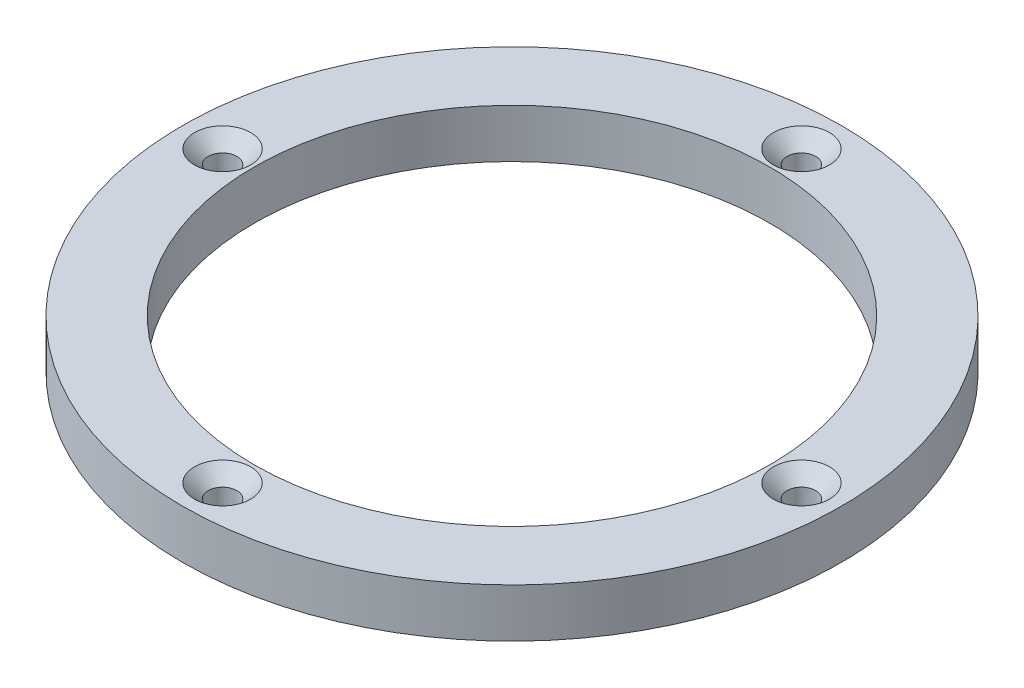
ISO-10303-21;
HEADER;
FILE_DESCRIPTION(('STEP AP214'),'2;1');
FILE_NAME('part.step','',(''),(''),'','','');
FILE_SCHEMA(('AUTOMOTIVE_DESIGN { 1 0 10303 214 1 1 1 1 }'));
ENDSEC;
DATA;
#1=APPLICATION_CONTEXT('core data for automotive mechanical design processes');
#2=APPLICATION_PROTOCOL_DEFINITION('international standard','automotive_design',2000,#1);
#3=PRODUCT_CONTEXT('',#1,'mechanical');
#4=PRODUCT('Part','Part','',(#3));
#5=PRODUCT_RELATED_PRODUCT_CATEGORY('part','',(#4));
#6=PRODUCT_DEFINITION_FORMATION('','',#4);
#7=PRODUCT_DEFINITION_CONTEXT('part definition',#1,'design');
#8=PRODUCT_DEFINITION('design','',#6,#7);
#9=PRODUCT_DEFINITION_SHAPE('','',#8);
#10=(LENGTH_UNIT() NAMED_UNIT(*) SI_UNIT(.MILLI.,.METRE.));
#11=(NAMED_UNIT(*) PLANE_ANGLE_UNIT() SI_UNIT($,.RADIAN.));
#12=(NAMED_UNIT(*) SI_UNIT($,.STERADIAN.) SOLID_ANGLE_UNIT());
#13=UNCERTAINTY_MEASURE_WITH_UNIT(LENGTH_MEASURE(1.E-05),#10,'distance_accuracy_value','');
#14=(GEOMETRIC_REPRESENTATION_CONTEXT(3) GLOBAL_UNCERTAINTY_ASSIGNED_CONTEXT((#13)) GLOBAL_UNIT_ASSIGNED_CONTEXT((#10,
#11,#12)) REPRESENTATION_CONTEXT('',''));
#15=CARTESIAN_POINT('',(0.,0.,0.));
#16=DIRECTION('',(0.,0.,1.));
#17=DIRECTION('',(1.,0.,0.));
#18=AXIS2_PLACEMENT_3D('',#15,#16,#17);
#19=CARTESIAN_POINT('',(0.,-8.5,0.));
#20=DIRECTION('',(0.,1.,0.));
#21=DIRECTION('',(0.,0.,1.));
#22=AXIS2_PLACEMENT_3D('',#19,#20,#21);
#23=CYLINDRICAL_SURFACE('',#22,57.5);
#24=CARTESIAN_POINT('',(0.,-8.5,0.));
#25=DIRECTION('',(0.,1.,0.));
#26=DIRECTION('',(0.,0.,1.));
#27=AXIS2_PLACEMENT_3D('',#24,#25,#26);
#28=CIRCLE('',#27,57.5);
#29=CARTESIAN_POINT('',(0.,-8.5,57.5));
#30=VERTEX_POINT('',#29);
#31=EDGE_CURVE('E10',#30,#30,#28,.T.);
#32=ORIENTED_EDGE('',*,*,#31,.T.);
#33=EDGE_LOOP('',(#32));
#34=FACE_BOUND('',#33,.T.);
#35=CARTESIAN_POINT('',(0.,0.,0.));
#36=DIRECTION('',(0.,1.,0.));
#37=DIRECTION('',(0.,0.,1.));
#38=AXIS2_PLACEMENT_3D('',#35,#36,#37);
#39=CIRCLE('',#38,57.5);
#40=CARTESIAN_POINT('',(0.,0.,57.5));
#41=VERTEX_POINT('',#40);
#42=EDGE_CURVE('E50',#41,#41,#39,.T.);
#43=ORIENTED_EDGE('',*,*,#42,.F.);
#44=EDGE_LOOP('',(#43));
#45=FACE_BOUND('',#44,.T.);
#46=ADVANCED_FACE('F42',(#34,#45),#23,.T.);
#47=CARTESIAN_POINT('',(0.,-8.5,0.));
#48=DIRECTION('',(0.,1.,0.));
#49=DIRECTION('',(0.,0.,1.));
#50=AXIS2_PLACEMENT_3D('',#47,#48,#49);
#51=PLANE('',#50);
#52=CARTESIAN_POINT('',(-50.5,-8.5,-5.28959422834735E-13));
#53=DIRECTION('',(0.,1.,0.));
#54=DIRECTION('',(0.,0.,1.));
#55=AXIS2_PLACEMENT_3D('',#52,#53,#54);
#56=CIRCLE('',#55,2.5);
#57=CARTESIAN_POINT('',(-50.5,-8.5,2.49999999999947));
#58=VERTEX_POINT('',#57);
#59=EDGE_CURVE('E66',#58,#58,#56,.T.);
#60=ORIENTED_EDGE('',*,*,#59,.T.);
#61=EDGE_LOOP('',(#60));
#62=FACE_BOUND('',#61,.T.);
#63=CARTESIAN_POINT('',(-3.52639615223157E-13,-8.5,50.5));
#64=DIRECTION('',(0.,1.,0.));
#65=DIRECTION('',(0.,0.,1.));
#66=AXIS2_PLACEMENT_3D('',#63,#64,#65);
#67=CIRCLE('',#66,2.5);
#68=CARTESIAN_POINT('',(-3.52639615223157E-13,-8.5,53.));
#69=VERTEX_POINT('',#68);
#70=EDGE_CURVE('E97',#69,#69,#67,.T.);
#71=ORIENTED_EDGE('',*,*,#70,.T.);
#72=EDGE_LOOP('',(#71));
#73=FACE_BOUND('',#72,.T.);
#74=CARTESIAN_POINT('',(50.5,-8.5,1.76319807611578E-13));
#75=DIRECTION('',(0.,1.,0.));
#76=DIRECTION('',(0.,0.,1.));
#77=AXIS2_PLACEMENT_3D('',#74,#75,#76);
#78=CIRCLE('',#77,2.5);
#79=CARTESIAN_POINT('',(50.5,-8.5,2.50000000000018));
#80=VERTEX_POINT('',#79);
#81=EDGE_CURVE('E101',#80,#80,#78,.T.);
#82=ORIENTED_EDGE('',*,*,#81,.T.);
#83=EDGE_LOOP('',(#82));
#84=FACE_BOUND('',#83,.T.);
#85=CARTESIAN_POINT('',(0.,-8.5,-50.5));
#86=DIRECTION('',(0.,1.,0.));
#87=DIRECTION('',(0.,0.,1.));
#88=AXIS2_PLACEMENT_3D('',#85,#86,#87);
#89=CIRCLE('',#88,2.5);
#90=CARTESIAN_POINT('',(0.,-8.5,-48.));
#91=VERTEX_POINT('',#90);
#92=EDGE_CURVE('E105',#91,#91,#89,.T.);
#93=ORIENTED_EDGE('',*,*,#92,.T.);
#94=EDGE_LOOP('',(#93));
#95=FACE_BOUND('',#94,.T.);
#96=CARTESIAN_POINT('',(0.,-8.5,0.));
#97=DIRECTION('',(0.,1.,0.));
#98=DIRECTION('',(0.,0.,1.));
#99=AXIS2_PLACEMENT_3D('',#96,#97,#98);
#100=CIRCLE('',#99,45.);
#101=CARTESIAN_POINT('',(0.,-8.5,45.));
#102=VERTEX_POINT('',#101);
#103=EDGE_CURVE('E56',#102,#102,#100,.T.);
#104=ORIENTED_EDGE('',*,*,#103,.T.);
#105=EDGE_LOOP('',(#104));
#106=FACE_BOUND('',#105,.T.);
#107=ORIENTED_EDGE('',*,*,#31,.F.);
#108=EDGE_LOOP('',(#107));
#109=FACE_BOUND('',#108,.T.);
#110=ADVANCED_FACE('F121',(#62,#73,#84,#95,#106,#109),#51,.F.);
#111=CARTESIAN_POINT('',(0.,0.,0.));
#112=DIRECTION('',(0.,1.,0.));
#113=DIRECTION('',(0.,0.,1.));
#114=AXIS2_PLACEMENT_3D('',#111,#112,#113);
#115=PLANE('',#114);
#116=CARTESIAN_POINT('',(50.5,0.,-5.28959422834735E-13));
#117=DIRECTION('',(0.,-1.,0.));
#118=DIRECTION('',(1.,0.,0.));
#119=AXIS2_PLACEMENT_3D('',#116,#117,#118);
#120=CIRCLE('',#119,4.9);
#121=CARTESIAN_POINT('',(55.4,0.,-5.80284198515729E-13));
#122=VERTEX_POINT('',#121);
#123=EDGE_CURVE('E88',#122,#122,#120,.T.);
#124=ORIENTED_EDGE('',*,*,#123,.T.);
#125=EDGE_LOOP('',(#124));
#126=FACE_BOUND('',#125,.T.);
#127=CARTESIAN_POINT('',(0.,0.,50.5));
#128=DIRECTION('',(0.,-1.,0.));
#129=DIRECTION('',(0.,0.,1.));
#130=AXIS2_PLACEMENT_3D('',#127,#128,#129);
#131=CIRCLE('',#130,4.9);
#132=CARTESIAN_POINT('',(0.,0.,55.4));
#133=VERTEX_POINT('',#132);
#134=EDGE_CURVE('E75',#133,#133,#131,.T.);
#135=ORIENTED_EDGE('',*,*,#134,.T.);
#136=EDGE_LOOP('',(#135));
#137=FACE_BOUND('',#136,.T.);
#138=CARTESIAN_POINT('',(-50.5,0.,1.76319807611578E-13));
#139=DIRECTION('',(0.,-1.,0.));
#140=DIRECTION('',(-1.,0.,0.));
#141=AXIS2_PLACEMENT_3D('',#138,#139,#140);
#142=CIRCLE('',#141,4.9);
#143=CARTESIAN_POINT('',(-55.4,0.,1.9342806617191E-13));
#144=VERTEX_POINT('',#143);
#145=EDGE_CURVE('E71',#144,#144,#142,.T.);
#146=ORIENTED_EDGE('',*,*,#145,.T.);
#147=EDGE_LOOP('',(#146));
#148=FACE_BOUND('',#147,.T.);
#149=CARTESIAN_POINT('',(0.,0.,-50.5));
#150=DIRECTION('',(0.,-1.,0.));
#151=DIRECTION('',(0.,0.,-1.));
#152=AXIS2_PLACEMENT_3D('',#149,#150,#151);
#153=CIRCLE('',#152,4.9);
#154=CARTESIAN_POINT('',(0.,0.,-55.4));
#155=VERTEX_POINT('',#154);
#156=EDGE_CURVE('E67',#155,#155,#153,.T.);
#157=ORIENTED_EDGE('',*,*,#156,.T.);
#158=EDGE_LOOP('',(#157));
#159=FACE_BOUND('',#158,.T.);
#160=CARTESIAN_POINT('',(0.,0.,0.));
#161=DIRECTION('',(0.,1.,0.));
#162=DIRECTION('',(0.,0.,1.));
#163=AXIS2_PLACEMENT_3D('',#160,#161,#162);
#164=CIRCLE('',#163,45.);
#165=CARTESIAN_POINT('',(0.,0.,45.));
#166=VERTEX_POINT('',#165);
#167=EDGE_CURVE('E59',#166,#166,#164,.T.);
#168=ORIENTED_EDGE('',*,*,#167,.F.);
#169=EDGE_LOOP('',(#168));
#170=FACE_BOUND('',#169,.T.);
#171=ORIENTED_EDGE('',*,*,#42,.T.);
#172=EDGE_LOOP('',(#171));
#173=FACE_BOUND('',#172,.T.);
#174=ADVANCED_FACE('F118',(#126,#137,#148,#159,#170,#173),#115,.T.);
#175=CARTESIAN_POINT('',(0.,-8.5,0.));
#176=DIRECTION('',(0.,1.,0.));
#177=DIRECTION('',(0.,0.,1.));
#178=AXIS2_PLACEMENT_3D('',#175,#176,#177);
#179=CYLINDRICAL_SURFACE('',#178,45.);
#180=ORIENTED_EDGE('',*,*,#103,.F.);
#181=EDGE_LOOP('',(#180));
#182=FACE_BOUND('',#181,.T.);
#183=ORIENTED_EDGE('',*,*,#167,.T.);
#184=EDGE_LOOP('',(#183));
#185=FACE_BOUND('',#184,.T.);
#186=ADVANCED_FACE('F116',(#182,#185),#179,.F.);
#187=CARTESIAN_POINT('',(0.,-8.5,-50.5));
#188=DIRECTION('',(0.,1.,0.));
#189=DIRECTION('',(0.,0.,1.));
#190=AXIS2_PLACEMENT_3D('',#187,#188,#189);
#191=CYLINDRICAL_SURFACE('',#190,2.5);
#192=CARTESIAN_POINT('',(0.,-2.39999999999998,-50.5));
#193=DIRECTION('',(0.,1.,0.));
#194=DIRECTION('',(0.,0.,1.));
#195=AXIS2_PLACEMENT_3D('',#192,#193,#194);
#196=CIRCLE('',#195,2.5);
#197=CARTESIAN_POINT('',(0.,-2.39999999999998,-48.));
#198=VERTEX_POINT('',#197);
#199=EDGE_CURVE('E62',#198,#198,#196,.T.);
#200=ORIENTED_EDGE('',*,*,#199,.T.);
#201=EDGE_LOOP('',(#200));
#202=FACE_BOUND('',#201,.T.);
#203=ORIENTED_EDGE('',*,*,#92,.F.);
#204=EDGE_LOOP('',(#203));
#205=FACE_BOUND('',#204,.T.);
#206=ADVANCED_FACE('F137',(#202,#205),#191,.F.);
#207=CARTESIAN_POINT('',(50.5,-8.5,1.76319807611578E-13));
#208=DIRECTION('',(0.,1.,0.));
#209=DIRECTION('',(0.,0.,1.));
#210=AXIS2_PLACEMENT_3D('',#207,#208,#209);
#211=CYLINDRICAL_SURFACE('',#210,2.5);
#212=CARTESIAN_POINT('',(50.5,-2.39999999999998,-5.28959422834735E-13));
#213=DIRECTION('',(0.,1.,0.));
#214=DIRECTION('',(0.,0.,1.));
#215=AXIS2_PLACEMENT_3D('',#212,#213,#214);
#216=CIRCLE('',#215,2.5);
#217=CARTESIAN_POINT('',(50.5,-2.39999999999998,2.49999999999947));
#218=VERTEX_POINT('',#217);
#219=EDGE_CURVE('E45',#218,#218,#216,.T.);
#220=ORIENTED_EDGE('',*,*,#219,.T.);
#221=EDGE_LOOP('',(#220));
#222=FACE_BOUND('',#221,.T.);
#223=ORIENTED_EDGE('',*,*,#81,.F.);
#224=EDGE_LOOP('',(#223));
#225=FACE_BOUND('',#224,.T.);
#226=ADVANCED_FACE('F141',(#222,#225),#211,.F.);
#227=CARTESIAN_POINT('',(-3.52639615223157E-13,-8.5,50.5));
#228=DIRECTION('',(0.,1.,0.));
#229=DIRECTION('',(0.,0.,1.));
#230=AXIS2_PLACEMENT_3D('',#227,#228,#229);
#231=CYLINDRICAL_SURFACE('',#230,2.5);
#232=CARTESIAN_POINT('',(0.,-2.39999999999998,50.5));
#233=DIRECTION('',(0.,1.,0.));
#234=DIRECTION('',(0.,0.,1.));
#235=AXIS2_PLACEMENT_3D('',#232,#233,#234);
#236=CIRCLE('',#235,2.5);
#237=CARTESIAN_POINT('',(0.,-2.39999999999998,53.));
#238=VERTEX_POINT('',#237);
#239=EDGE_CURVE('E72',#238,#238,#236,.T.);
#240=ORIENTED_EDGE('',*,*,#239,.T.);
#241=EDGE_LOOP('',(#240));
#242=FACE_BOUND('',#241,.T.);
#243=ORIENTED_EDGE('',*,*,#70,.F.);
#244=EDGE_LOOP('',(#243));
#245=FACE_BOUND('',#244,.T.);
#246=ADVANCED_FACE('F145',(#242,#245),#231,.F.);
#247=CARTESIAN_POINT('',(-50.5,-8.5,-5.28959422834735E-13));
#248=DIRECTION('',(0.,1.,0.));
#249=DIRECTION('',(0.,0.,1.));
#250=AXIS2_PLACEMENT_3D('',#247,#248,#249);
#251=CYLINDRICAL_SURFACE('',#250,2.5);
#252=CARTESIAN_POINT('',(-50.5,-2.39999999999998,1.76319807611578E-13));
#253=DIRECTION('',(0.,1.,0.));
#254=DIRECTION('',(0.,0.,1.));
#255=AXIS2_PLACEMENT_3D('',#252,#253,#254);
#256=CIRCLE('',#255,2.5);
#257=CARTESIAN_POINT('',(-50.5,-2.39999999999998,2.50000000000018));
#258=VERTEX_POINT('',#257);
#259=EDGE_CURVE('E68',#258,#258,#256,.T.);
#260=ORIENTED_EDGE('',*,*,#259,.T.);
#261=EDGE_LOOP('',(#260));
#262=FACE_BOUND('',#261,.T.);
#263=ORIENTED_EDGE('',*,*,#59,.F.);
#264=EDGE_LOOP('',(#263));
#265=FACE_BOUND('',#264,.T.);
#266=ADVANCED_FACE('F149',(#262,#265),#251,.F.);
#267=CARTESIAN_POINT('',(0.,-3.3,-50.5));
#268=DIRECTION('',(0.,1.,0.));
#269=DIRECTION('',(0.,0.,1.));
#270=AXIS2_PLACEMENT_3D('',#267,#268,#269);
#271=CONICAL_SURFACE('',#270,1.59999999999997,0.785398163397453);
#272=ORIENTED_EDGE('',*,*,#156,.F.);
#273=EDGE_LOOP('',(#272));
#274=FACE_BOUND('',#273,.T.);
#275=ORIENTED_EDGE('',*,*,#199,.F.);
#276=EDGE_LOOP('',(#275));
#277=FACE_BOUND('',#276,.T.);
#278=ADVANCED_FACE('F152',(#274,#277),#271,.F.);
#279=CARTESIAN_POINT('',(-50.5,-3.3,1.76319807611578E-13));
#280=DIRECTION('',(0.,1.,0.));
#281=DIRECTION('',(1.,0.,0.));
#282=AXIS2_PLACEMENT_3D('',#279,#280,#281);
#283=CONICAL_SURFACE('',#282,1.59999999999997,0.785398163397453);
#284=ORIENTED_EDGE('',*,*,#145,.F.);
#285=EDGE_LOOP('',(#284));
#286=FACE_BOUND('',#285,.T.);
#287=ORIENTED_EDGE('',*,*,#259,.F.);
#288=EDGE_LOOP('',(#287));
#289=FACE_BOUND('',#288,.T.);
#290=ADVANCED_FACE('F156',(#286,#289),#283,.F.);
#291=CARTESIAN_POINT('',(0.,-3.3,50.5));
#292=DIRECTION('',(0.,1.,0.));
#293=DIRECTION('',(0.,0.,-1.));
#294=AXIS2_PLACEMENT_3D('',#291,#292,#293);
#295=CONICAL_SURFACE('',#294,1.59999999999997,0.785398163397453);
#296=ORIENTED_EDGE('',*,*,#134,.F.);
#297=EDGE_LOOP('',(#296));
#298=FACE_BOUND('',#297,.T.);
#299=ORIENTED_EDGE('',*,*,#239,.F.);
#300=EDGE_LOOP('',(#299));
#301=FACE_BOUND('',#300,.T.);
#302=ADVANCED_FACE('F160',(#298,#301),#295,.F.);
#303=CARTESIAN_POINT('',(50.5,-3.3,-5.28959422834735E-13));
#304=DIRECTION('',(0.,1.,0.));
#305=DIRECTION('',(-1.,0.,0.));
#306=AXIS2_PLACEMENT_3D('',#303,#304,#305);
#307=CONICAL_SURFACE('',#306,1.59999999999997,0.785398163397453);
#308=ORIENTED_EDGE('',*,*,#123,.F.);
#309=EDGE_LOOP('',(#308));
#310=FACE_BOUND('',#309,.T.);
#311=ORIENTED_EDGE('',*,*,#219,.F.);
#312=EDGE_LOOP('',(#311));
#313=FACE_BOUND('',#312,.T.);
#314=ADVANCED_FACE('F164',(#310,#313),#307,.F.);
#315=CLOSED_SHELL('',(#46,#110,#174,#186,#206,#226,#246,#266,#278,#290,#302,#314));
#316=MANIFOLD_SOLID_BREP('B2',#315);
#317=ADVANCED_BREP_SHAPE_REPRESENTATION('',(#18,#316),#14);
#318=SHAPE_DEFINITION_REPRESENTATION(#9,#317);
ENDSEC;
END-ISO-10303-21;
